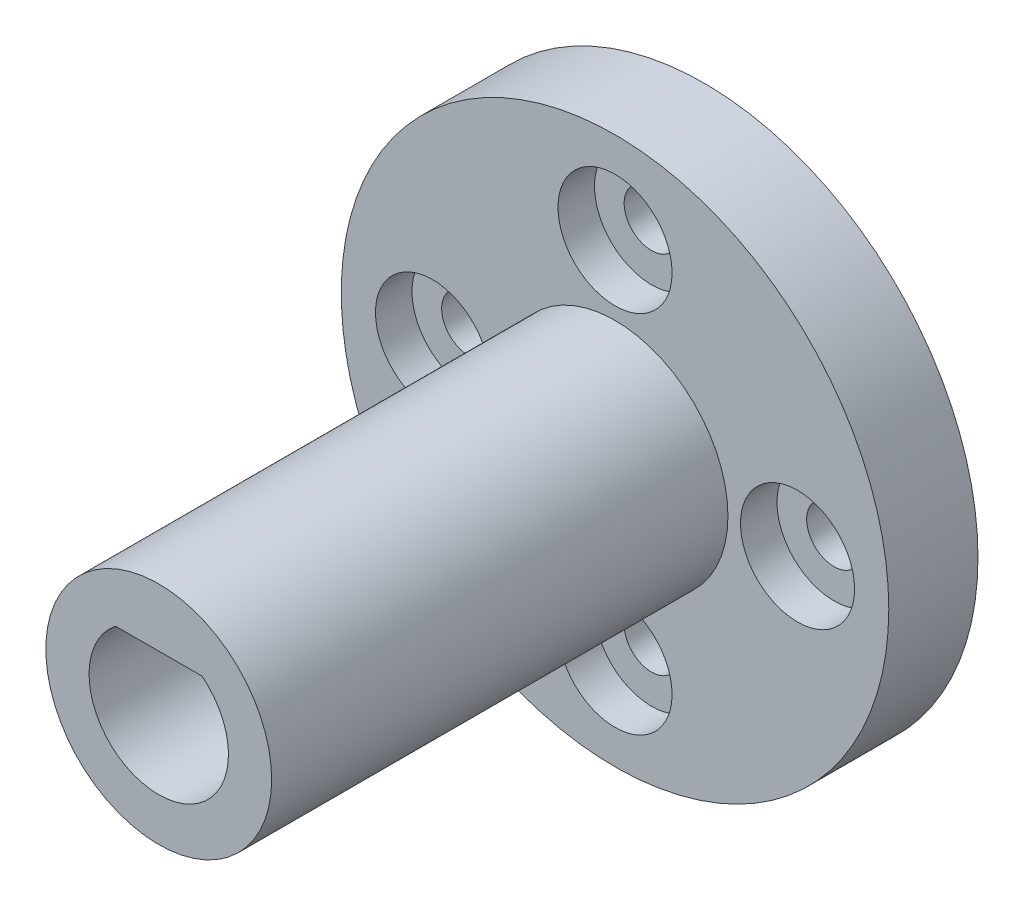
ISO-10303-21;
HEADER;
FILE_DESCRIPTION(('STEP AP214'),'2;1');
FILE_NAME('part.step','',(''),(''),'','','');
FILE_SCHEMA(('AUTOMOTIVE_DESIGN { 1 0 10303 214 1 1 1 1 }'));
ENDSEC;
DATA;
#1=APPLICATION_CONTEXT('core data for automotive mechanical design processes');
#2=APPLICATION_PROTOCOL_DEFINITION('international standard','automotive_design',2000,#1);
#3=PRODUCT_CONTEXT('',#1,'mechanical');
#4=PRODUCT('Part','Part','',(#3));
#5=PRODUCT_RELATED_PRODUCT_CATEGORY('part','',(#4));
#6=PRODUCT_DEFINITION_FORMATION('','',#4);
#7=PRODUCT_DEFINITION_CONTEXT('part definition',#1,'design');
#8=PRODUCT_DEFINITION('design','',#6,#7);
#9=PRODUCT_DEFINITION_SHAPE('','',#8);
#10=(LENGTH_UNIT() NAMED_UNIT(*) SI_UNIT(.MILLI.,.METRE.));
#11=(NAMED_UNIT(*) PLANE_ANGLE_UNIT() SI_UNIT($,.RADIAN.));
#12=(NAMED_UNIT(*) SI_UNIT($,.STERADIAN.) SOLID_ANGLE_UNIT());
#13=UNCERTAINTY_MEASURE_WITH_UNIT(LENGTH_MEASURE(1.E-05),#10,'distance_accuracy_value','');
#14=(GEOMETRIC_REPRESENTATION_CONTEXT(3) GLOBAL_UNCERTAINTY_ASSIGNED_CONTEXT((#13)) GLOBAL_UNIT_ASSIGNED_CONTEXT((#10,
#11,#12)) REPRESENTATION_CONTEXT('',''));
#15=CARTESIAN_POINT('',(0.,0.,0.));
#16=DIRECTION('',(0.,0.,1.));
#17=DIRECTION('',(1.,0.,0.));
#18=AXIS2_PLACEMENT_3D('',#15,#16,#17);
#19=CARTESIAN_POINT('',(0.,0.,3.91));
#20=DIRECTION('',(0.,0.,-1.));
#21=DIRECTION('',(-1.,0.,0.));
#22=AXIS2_PLACEMENT_3D('',#19,#20,#21);
#23=CYLINDRICAL_SURFACE('',#22,12.);
#24=CARTESIAN_POINT('',(0.,0.,3.91));
#25=DIRECTION('',(0.,0.,1.));
#26=DIRECTION('',(1.,0.,0.));
#27=AXIS2_PLACEMENT_3D('',#24,#25,#26);
#28=CIRCLE('',#27,12.);
#29=CARTESIAN_POINT('',(12.,0.,3.91));
#30=VERTEX_POINT('',#29);
#31=EDGE_CURVE('E11',#30,#30,#28,.T.);
#32=ORIENTED_EDGE('',*,*,#31,.F.);
#33=EDGE_LOOP('',(#32));
#34=FACE_BOUND('',#33,.T.);
#35=CARTESIAN_POINT('',(0.,0.,0.));
#36=DIRECTION('',(0.,0.,1.));
#37=DIRECTION('',(1.,0.,0.));
#38=AXIS2_PLACEMENT_3D('',#35,#36,#37);
#39=CIRCLE('',#38,12.);
#40=CARTESIAN_POINT('',(12.,0.,0.));
#41=VERTEX_POINT('',#40);
#42=EDGE_CURVE('E40',#41,#41,#39,.T.);
#43=ORIENTED_EDGE('',*,*,#42,.T.);
#44=EDGE_LOOP('',(#43));
#45=FACE_BOUND('',#44,.T.);
#46=ADVANCED_FACE('F37',(#34,#45),#23,.T.);
#47=CARTESIAN_POINT('',(0.,0.,3.91));
#48=DIRECTION('',(0.,0.,1.));
#49=DIRECTION('',(1.,0.,0.));
#50=AXIS2_PLACEMENT_3D('',#47,#48,#49);
#51=PLANE('',#50);
#52=CARTESIAN_POINT('',(8.,0.,3.91));
#53=DIRECTION('',(0.,0.,1.));
#54=DIRECTION('',(1.,0.,0.));
#55=AXIS2_PLACEMENT_3D('',#52,#53,#54);
#56=CIRCLE('',#55,2.5);
#57=CARTESIAN_POINT('',(10.5,0.,3.91));
#58=VERTEX_POINT('',#57);
#59=EDGE_CURVE('E307',#58,#58,#56,.T.);
#60=ORIENTED_EDGE('',*,*,#59,.F.);
#61=EDGE_LOOP('',(#60));
#62=FACE_BOUND('',#61,.T.);
#63=CARTESIAN_POINT('',(0.,-8.,3.91));
#64=DIRECTION('',(0.,0.,1.));
#65=DIRECTION('',(1.,0.,0.));
#66=AXIS2_PLACEMENT_3D('',#63,#64,#65);
#67=CIRCLE('',#66,2.5);
#68=CARTESIAN_POINT('',(2.5,-8.,3.91));
#69=VERTEX_POINT('',#68);
#70=EDGE_CURVE('E317',#69,#69,#67,.T.);
#71=ORIENTED_EDGE('',*,*,#70,.F.);
#72=EDGE_LOOP('',(#71));
#73=FACE_BOUND('',#72,.T.);
#74=CARTESIAN_POINT('',(-8.,0.,3.91));
#75=DIRECTION('',(0.,0.,1.));
#76=DIRECTION('',(1.,0.,0.));
#77=AXIS2_PLACEMENT_3D('',#74,#75,#76);
#78=CIRCLE('',#77,2.5);
#79=CARTESIAN_POINT('',(-5.50000000000001,0.,3.91));
#80=VERTEX_POINT('',#79);
#81=EDGE_CURVE('E329',#80,#80,#78,.T.);
#82=ORIENTED_EDGE('',*,*,#81,.F.);
#83=EDGE_LOOP('',(#82));
#84=FACE_BOUND('',#83,.T.);
#85=CARTESIAN_POINT('',(0.,8.,3.91));
#86=DIRECTION('',(0.,0.,1.));
#87=DIRECTION('',(1.,0.,0.));
#88=AXIS2_PLACEMENT_3D('',#85,#86,#87);
#89=CIRCLE('',#88,2.5);
#90=CARTESIAN_POINT('',(2.5,8.,3.91));
#91=VERTEX_POINT('',#90);
#92=EDGE_CURVE('E341',#91,#91,#89,.T.);
#93=ORIENTED_EDGE('',*,*,#92,.F.);
#94=EDGE_LOOP('',(#93));
#95=FACE_BOUND('',#94,.T.);
#96=CARTESIAN_POINT('',(0.,0.,3.91));
#97=DIRECTION('',(0.,0.,1.));
#98=DIRECTION('',(1.,0.,0.));
#99=AXIS2_PLACEMENT_3D('',#96,#97,#98);
#100=CIRCLE('',#99,4.95);
#101=CARTESIAN_POINT('',(4.95,0.,3.91));
#102=VERTEX_POINT('',#101);
#103=EDGE_CURVE('E77',#102,#102,#100,.T.);
#104=ORIENTED_EDGE('',*,*,#103,.F.);
#105=EDGE_LOOP('',(#104));
#106=FACE_BOUND('',#105,.T.);
#107=ORIENTED_EDGE('',*,*,#31,.T.);
#108=EDGE_LOOP('',(#107));
#109=FACE_BOUND('',#108,.T.);
#110=ADVANCED_FACE('F96',(#62,#73,#84,#95,#106,#109),#51,.T.);
#111=CARTESIAN_POINT('',(0.,0.,0.));
#112=DIRECTION('',(0.,0.,1.));
#113=DIRECTION('',(1.,0.,0.));
#114=AXIS2_PLACEMENT_3D('',#111,#112,#113);
#115=PLANE('',#114);
#116=CARTESIAN_POINT('',(8.,0.,0.));
#117=DIRECTION('',(0.,0.,1.));
#118=DIRECTION('',(1.,0.,0.));
#119=AXIS2_PLACEMENT_3D('',#116,#117,#118);
#120=CIRCLE('',#119,1.2);
#121=CARTESIAN_POINT('',(9.2,0.,0.));
#122=VERTEX_POINT('',#121);
#123=EDGE_CURVE('E314',#122,#122,#120,.T.);
#124=ORIENTED_EDGE('',*,*,#123,.T.);
#125=EDGE_LOOP('',(#124));
#126=FACE_BOUND('',#125,.T.);
#127=CARTESIAN_POINT('',(0.,-8.,0.));
#128=DIRECTION('',(0.,0.,1.));
#129=DIRECTION('',(1.,0.,0.));
#130=AXIS2_PLACEMENT_3D('',#127,#128,#129);
#131=CIRCLE('',#130,1.2);
#132=CARTESIAN_POINT('',(1.2,-8.,0.));
#133=VERTEX_POINT('',#132);
#134=EDGE_CURVE('E326',#133,#133,#131,.T.);
#135=ORIENTED_EDGE('',*,*,#134,.T.);
#136=EDGE_LOOP('',(#135));
#137=FACE_BOUND('',#136,.T.);
#138=CARTESIAN_POINT('',(-8.,0.,0.));
#139=DIRECTION('',(0.,0.,1.));
#140=DIRECTION('',(1.,0.,0.));
#141=AXIS2_PLACEMENT_3D('',#138,#139,#140);
#142=CIRCLE('',#141,1.2);
#143=CARTESIAN_POINT('',(-6.8,0.,0.));
#144=VERTEX_POINT('',#143);
#145=EDGE_CURVE('E338',#144,#144,#142,.T.);
#146=ORIENTED_EDGE('',*,*,#145,.T.);
#147=EDGE_LOOP('',(#146));
#148=FACE_BOUND('',#147,.T.);
#149=CARTESIAN_POINT('',(0.,8.,0.));
#150=DIRECTION('',(0.,0.,1.));
#151=DIRECTION('',(1.,0.,0.));
#152=AXIS2_PLACEMENT_3D('',#149,#150,#151);
#153=CIRCLE('',#152,1.2);
#154=CARTESIAN_POINT('',(1.2,8.,0.));
#155=VERTEX_POINT('',#154);
#156=EDGE_CURVE('E67',#155,#155,#153,.T.);
#157=ORIENTED_EDGE('',*,*,#156,.T.);
#158=EDGE_LOOP('',(#157));
#159=FACE_BOUND('',#158,.T.);
#160=CARTESIAN_POINT('',(0.,0.,0.));
#161=DIRECTION('',(0.,0.,-1.));
#162=DIRECTION('',(-1.,0.,0.));
#163=AXIS2_PLACEMENT_3D('',#160,#161,#162);
#164=CIRCLE('',#163,4.);
#165=CARTESIAN_POINT('',(-4.,0.,0.));
#166=VERTEX_POINT('',#165);
#167=EDGE_CURVE('E84',#166,#166,#164,.T.);
#168=ORIENTED_EDGE('',*,*,#167,.F.);
#169=EDGE_LOOP('',(#168));
#170=FACE_BOUND('',#169,.T.);
#171=ORIENTED_EDGE('',*,*,#42,.F.);
#172=EDGE_LOOP('',(#171));
#173=FACE_BOUND('',#172,.T.);
#174=ADVANCED_FACE('F93',(#126,#137,#148,#159,#170,#173),#115,.F.);
#175=CARTESIAN_POINT('',(0.,0.,1.91));
#176=DIRECTION('',(0.,0.,-1.));
#177=DIRECTION('',(-1.,0.,0.));
#178=AXIS2_PLACEMENT_3D('',#175,#176,#177);
#179=CYLINDRICAL_SURFACE('',#178,4.);
#180=CARTESIAN_POINT('',(0.,0.,1.91));
#181=DIRECTION('',(0.,0.,-1.));
#182=DIRECTION('',(-1.,0.,0.));
#183=AXIS2_PLACEMENT_3D('',#180,#181,#182);
#184=CIRCLE('',#183,4.);
#185=CARTESIAN_POINT('',(-4.,0.,1.91));
#186=VERTEX_POINT('',#185);
#187=EDGE_CURVE('E85',#186,#186,#184,.T.);
#188=CARTESIAN_POINT('',(-4.,0.,1.91));
#189=CARTESIAN_POINT('',(-4.,0.,1.89010416666667));
#190=CARTESIAN_POINT('',(-4.,0.,1.87020833333333));
#191=CARTESIAN_POINT('',(-4.,0.,1.83041666666667));
#192=CARTESIAN_POINT('',(-4.,0.,1.81052083333333));
#193=CARTESIAN_POINT('',(-4.,0.,1.77072916666667));
#194=CARTESIAN_POINT('',(-4.,0.,1.75083333333333));
#195=CARTESIAN_POINT('',(-4.,0.,1.71104166666667));
#196=CARTESIAN_POINT('',(-4.,0.,1.69114583333333));
#197=CARTESIAN_POINT('',(-4.,0.,1.65135416666667));
#198=CARTESIAN_POINT('',(-4.,0.,1.63145833333333));
#199=CARTESIAN_POINT('',(-4.,0.,1.59166666666667));
#200=CARTESIAN_POINT('',(-4.,0.,1.57177083333333));
#201=CARTESIAN_POINT('',(-4.,0.,1.53197916666667));
#202=CARTESIAN_POINT('',(-4.,0.,1.51208333333333));
#203=CARTESIAN_POINT('',(-4.,0.,1.47229166666667));
#204=CARTESIAN_POINT('',(-4.,0.,1.45239583333333));
#205=CARTESIAN_POINT('',(-4.,0.,1.41260416666667));
#206=CARTESIAN_POINT('',(-4.,0.,1.39270833333333));
#207=CARTESIAN_POINT('',(-4.,0.,1.35291666666667));
#208=CARTESIAN_POINT('',(-4.,0.,1.33302083333333));
#209=CARTESIAN_POINT('',(-4.,0.,1.29322916666667));
#210=CARTESIAN_POINT('',(-4.,0.,1.27333333333333));
#211=CARTESIAN_POINT('',(-4.,0.,1.23354166666667));
#212=CARTESIAN_POINT('',(-4.,0.,1.21364583333333));
#213=CARTESIAN_POINT('',(-4.,0.,1.17385416666667));
#214=CARTESIAN_POINT('',(-4.,0.,1.15395833333333));
#215=CARTESIAN_POINT('',(-4.,0.,1.11416666666667));
#216=CARTESIAN_POINT('',(-4.,0.,1.09427083333333));
#217=CARTESIAN_POINT('',(-4.,0.,1.05447916666667));
#218=CARTESIAN_POINT('',(-4.,0.,1.03458333333333));
#219=CARTESIAN_POINT('',(-4.,0.,0.994791666666667));
#220=CARTESIAN_POINT('',(-4.,0.,0.974895833333334));
#221=CARTESIAN_POINT('',(-4.,0.,0.935104166666667));
#222=CARTESIAN_POINT('',(-4.,0.,0.915208333333333));
#223=CARTESIAN_POINT('',(-4.,0.,0.875416666666667));
#224=CARTESIAN_POINT('',(-4.,0.,0.855520833333333));
#225=CARTESIAN_POINT('',(-4.,0.,0.815729166666667));
#226=CARTESIAN_POINT('',(-4.,0.,0.795833333333333));
#227=CARTESIAN_POINT('',(-4.,0.,0.756041666666667));
#228=CARTESIAN_POINT('',(-4.,0.,0.736145833333333));
#229=CARTESIAN_POINT('',(-4.,0.,0.696354166666667));
#230=CARTESIAN_POINT('',(-4.,0.,0.676458333333333));
#231=CARTESIAN_POINT('',(-4.,0.,0.636666666666667));
#232=CARTESIAN_POINT('',(-4.,0.,0.616770833333333));
#233=CARTESIAN_POINT('',(-4.,0.,0.576979166666667));
#234=CARTESIAN_POINT('',(-4.,0.,0.557083333333333));
#235=CARTESIAN_POINT('',(-4.,0.,0.517291666666667));
#236=CARTESIAN_POINT('',(-4.,0.,0.497395833333333));
#237=CARTESIAN_POINT('',(-4.,0.,0.457604166666667));
#238=CARTESIAN_POINT('',(-4.,0.,0.437708333333333));
#239=CARTESIAN_POINT('',(-4.,0.,0.397916666666667));
#240=CARTESIAN_POINT('',(-4.,0.,0.378020833333333));
#241=CARTESIAN_POINT('',(-4.,0.,0.338229166666667));
#242=CARTESIAN_POINT('',(-4.,0.,0.318333333333333));
#243=CARTESIAN_POINT('',(-4.,0.,0.278541666666667));
#244=CARTESIAN_POINT('',(-4.,0.,0.258645833333333));
#245=CARTESIAN_POINT('',(-4.,0.,0.218854166666667));
#246=CARTESIAN_POINT('',(-4.,0.,0.198958333333333));
#247=CARTESIAN_POINT('',(-4.,0.,0.159166666666667));
#248=CARTESIAN_POINT('',(-4.,0.,0.139270833333333));
#249=CARTESIAN_POINT('',(-4.,0.,0.0994791666666668));
#250=CARTESIAN_POINT('',(-4.,0.,0.0795833333333334));
#251=CARTESIAN_POINT('',(-4.,0.,0.0397916666666667));
#252=CARTESIAN_POINT('',(-4.,0.,0.0198958333333334));
#253=CARTESIAN_POINT('',(-4.,0.,0.));
#254=B_SPLINE_CURVE_WITH_KNOTS('',3,(#188,#189,#190,#191,#192,#193,#194,#195,#196,#197,#198,
#199,#200,#201,#202,#203,#204,#205,#206,#207,#208,#209,#210,#211,#212,#213,#214,#215,#216,#217,
#218,#219,#220,#221,#222,#223,#224,#225,#226,#227,#228,#229,#230,#231,#232,#233,#234,#235,#236,
#237,#238,#239,#240,#241,#242,#243,#244,#245,#246,#247,#248,#249,#250,#251,#252,#253),
.UNSPECIFIED.,.F.,.F.,(4,2,2,2,2,2,2,2,2,2,2,2,2,2,2,2,2,2,2,2,2,2,2,2,2,2,2,2,2,2,2,2,4),(0.,
0.0596874999999998,0.119375,0.1790625,0.23875,0.2984375,0.358125,0.4178125,0.4775,0.5371875,
0.596875,0.6565625,0.71625,0.7759375,0.835625,0.8953125,0.955,1.0146875,1.074375,1.1340625,
1.19375,1.2534375,1.313125,1.3728125,1.4325,1.4921875,1.551875,1.6115625,1.67125,1.7309375,
1.790625,1.8503125,1.91),.UNSPECIFIED.);
#255=EDGE_CURVE('BSEAM91',#186,#166,#254,.T.);
#256=ORIENTED_EDGE('',*,*,#187,.F.);
#257=ORIENTED_EDGE('',*,*,#167,.T.);
#258=ORIENTED_EDGE('',*,*,#255,.T.);
#259=ORIENTED_EDGE('',*,*,#255,.F.);
#260=EDGE_LOOP('',(#256,#258,#257,#259));
#261=FACE_BOUND('',#260,.T.);
#262=ADVANCED_FACE('F91',(#261),#179,.F.);
#263=CARTESIAN_POINT('',(0.,0.,1.91));
#264=DIRECTION('',(0.,0.,-1.));
#265=DIRECTION('',(-1.,0.,0.));
#266=AXIS2_PLACEMENT_3D('',#263,#264,#265);
#267=PLANE('',#266);
#268=ORIENTED_EDGE('',*,*,#187,.T.);
#269=EDGE_LOOP('',(#268));
#270=FACE_BOUND('',#269,.T.);
#271=ADVANCED_FACE('F140',(#270),#267,.T.);
#272=CARTESIAN_POINT('',(0.,2.395,23.91));
#273=DIRECTION('',(0.,-1.,0.));
#274=DIRECTION('',(0.,0.,-1.));
#275=AXIS2_PLACEMENT_3D('',#272,#273,#274);
#276=PLANE('',#275);
#277=DIRECTION('',(-1.,0.,0.));
#278=VECTOR('',#277,1.);
#279=CARTESIAN_POINT('',(0.,2.395,3.91));
#280=LINE('',#279,#278);
#281=CARTESIAN_POINT('',(1.89657586191536,2.395,3.91));
#282=VERTEX_POINT('',#281);
#283=CARTESIAN_POINT('',(-1.89657586191536,2.395,3.91));
#284=VERTEX_POINT('',#283);
#285=EDGE_CURVE('E64',#282,#284,#280,.T.);
#286=ORIENTED_EDGE('',*,*,#285,.F.);
#287=DIRECTION('',(0.,0.,-1.));
#288=VECTOR('',#287,1.);
#289=CARTESIAN_POINT('',(1.89657586191536,2.395,23.91));
#290=LINE('',#289,#288);
#291=CARTESIAN_POINT('',(1.89657586191536,2.395,23.91));
#292=VERTEX_POINT('',#291);
#293=EDGE_CURVE('E73',#292,#282,#290,.T.);
#294=ORIENTED_EDGE('',*,*,#293,.F.);
#295=DIRECTION('',(-1.,0.,0.));
#296=VECTOR('',#295,1.);
#297=CARTESIAN_POINT('',(0.,2.395,23.91));
#298=LINE('',#297,#296);
#299=CARTESIAN_POINT('',(-1.89657586191536,2.395,23.91));
#300=VERTEX_POINT('',#299);
#301=EDGE_CURVE('E71',#292,#300,#298,.T.);
#302=ORIENTED_EDGE('',*,*,#301,.T.);
#303=DIRECTION('',(0.,0.,-1.));
#304=VECTOR('',#303,1.);
#305=CARTESIAN_POINT('',(-1.89657586191536,2.395,23.91));
#306=LINE('',#305,#304);
#307=EDGE_CURVE('E58',#300,#284,#306,.T.);
#308=ORIENTED_EDGE('',*,*,#307,.T.);
#309=EDGE_LOOP('',(#286,#294,#302,#308));
#310=FACE_BOUND('',#309,.T.);
#311=ADVANCED_FACE('F69',(#310),#276,.T.);
#312=CARTESIAN_POINT('',(0.,0.,23.91));
#313=DIRECTION('',(0.,0.,-1.));
#314=DIRECTION('',(-1.,0.,0.));
#315=AXIS2_PLACEMENT_3D('',#312,#313,#314);
#316=CYLINDRICAL_SURFACE('',#315,3.055);
#317=CARTESIAN_POINT('',(0.,0.,3.91));
#318=DIRECTION('',(0.,0.,1.));
#319=DIRECTION('',(1.,0.,0.));
#320=AXIS2_PLACEMENT_3D('',#317,#318,#319);
#321=CIRCLE('',#320,3.055);
#322=EDGE_CURVE('E50',#284,#282,#321,.T.);
#323=ORIENTED_EDGE('',*,*,#322,.F.);
#324=ORIENTED_EDGE('',*,*,#307,.F.);
#325=CARTESIAN_POINT('',(0.,0.,23.91));
#326=DIRECTION('',(0.,0.,1.));
#327=DIRECTION('',(1.,0.,0.));
#328=AXIS2_PLACEMENT_3D('',#325,#326,#327);
#329=CIRCLE('',#328,3.055);
#330=EDGE_CURVE('E353',#300,#292,#329,.T.);
#331=ORIENTED_EDGE('',*,*,#330,.T.);
#332=ORIENTED_EDGE('',*,*,#293,.T.);
#333=EDGE_LOOP('',(#323,#324,#331,#332));
#334=FACE_BOUND('',#333,.T.);
#335=ADVANCED_FACE('F76',(#334),#316,.F.);
#336=CARTESIAN_POINT('',(0.,0.,23.91));
#337=DIRECTION('',(0.,0.,-1.));
#338=DIRECTION('',(-1.,0.,0.));
#339=AXIS2_PLACEMENT_3D('',#336,#337,#338);
#340=CYLINDRICAL_SURFACE('',#339,4.95);
#341=CARTESIAN_POINT('',(0.,0.,23.91));
#342=DIRECTION('',(0.,0.,1.));
#343=DIRECTION('',(1.,0.,0.));
#344=AXIS2_PLACEMENT_3D('',#341,#342,#343);
#345=CIRCLE('',#344,4.95);
#346=CARTESIAN_POINT('',(4.95,0.,23.91));
#347=VERTEX_POINT('',#346);
#348=EDGE_CURVE('E74',#347,#347,#345,.T.);
#349=ORIENTED_EDGE('',*,*,#348,.F.);
#350=EDGE_LOOP('',(#349));
#351=FACE_BOUND('',#350,.T.);
#352=ORIENTED_EDGE('',*,*,#103,.T.);
#353=EDGE_LOOP('',(#352));
#354=FACE_BOUND('',#353,.T.);
#355=ADVANCED_FACE('F125',(#351,#354),#340,.T.);
#356=CARTESIAN_POINT('',(0.,0.,23.91));
#357=DIRECTION('',(0.,0.,1.));
#358=DIRECTION('',(1.,0.,0.));
#359=AXIS2_PLACEMENT_3D('',#356,#357,#358);
#360=PLANE('',#359);
#361=ORIENTED_EDGE('',*,*,#301,.F.);
#362=ORIENTED_EDGE('',*,*,#330,.F.);
#363=EDGE_LOOP('',(#361,#362));
#364=FACE_BOUND('',#363,.T.);
#365=ORIENTED_EDGE('',*,*,#348,.T.);
#366=EDGE_LOOP('',(#365));
#367=FACE_BOUND('',#366,.T.);
#368=ADVANCED_FACE('F117',(#364,#367),#360,.T.);
#369=ORIENTED_EDGE('',*,*,#285,.T.);
#370=ORIENTED_EDGE('',*,*,#322,.T.);
#371=EDGE_LOOP('',(#369,#370));
#372=FACE_BOUND('',#371,.T.);
#373=ADVANCED_FACE('F65',(#372),#51,.T.);
#374=CARTESIAN_POINT('',(0.,8.,3.91));
#375=DIRECTION('',(0.,0.,1.));
#376=DIRECTION('',(1.,0.,0.));
#377=AXIS2_PLACEMENT_3D('',#374,#375,#376);
#378=CYLINDRICAL_SURFACE('',#377,1.2);
#379=ORIENTED_EDGE('',*,*,#156,.F.);
#380=EDGE_LOOP('',(#379));
#381=FACE_BOUND('',#380,.T.);
#382=CARTESIAN_POINT('',(0.,8.,2.31));
#383=DIRECTION('',(0.,0.,1.));
#384=DIRECTION('',(1.,0.,0.));
#385=AXIS2_PLACEMENT_3D('',#382,#383,#384);
#386=CIRCLE('',#385,1.2);
#387=CARTESIAN_POINT('',(1.2,8.,2.31));
#388=VERTEX_POINT('',#387);
#389=EDGE_CURVE('E347',#388,#388,#386,.T.);
#390=ORIENTED_EDGE('',*,*,#389,.T.);
#391=EDGE_LOOP('',(#390));
#392=FACE_BOUND('',#391,.T.);
#393=ADVANCED_FACE('F116',(#381,#392),#378,.F.);
#394=CARTESIAN_POINT('',(1.2,8.,2.31));
#395=DIRECTION('',(0.,0.,-1.));
#396=DIRECTION('',(-1.,0.,0.));
#397=AXIS2_PLACEMENT_3D('',#394,#395,#396);
#398=PLANE('',#397);
#399=ORIENTED_EDGE('',*,*,#389,.F.);
#400=EDGE_LOOP('',(#399));
#401=FACE_BOUND('',#400,.T.);
#402=CARTESIAN_POINT('',(0.,8.,2.31));
#403=DIRECTION('',(0.,0.,1.));
#404=DIRECTION('',(1.,0.,0.));
#405=AXIS2_PLACEMENT_3D('',#402,#403,#404);
#406=CIRCLE('',#405,2.5);
#407=CARTESIAN_POINT('',(2.5,8.,2.31));
#408=VERTEX_POINT('',#407);
#409=EDGE_CURVE('E344',#408,#408,#406,.T.);
#410=ORIENTED_EDGE('',*,*,#409,.T.);
#411=EDGE_LOOP('',(#410));
#412=FACE_BOUND('',#411,.T.);
#413=ADVANCED_FACE('F122',(#401,#412),#398,.F.);
#414=CARTESIAN_POINT('',(0.,8.,3.91));
#415=DIRECTION('',(0.,0.,1.));
#416=DIRECTION('',(1.,0.,0.));
#417=AXIS2_PLACEMENT_3D('',#414,#415,#416);
#418=CYLINDRICAL_SURFACE('',#417,2.5);
#419=ORIENTED_EDGE('',*,*,#409,.F.);
#420=EDGE_LOOP('',(#419));
#421=FACE_BOUND('',#420,.T.);
#422=ORIENTED_EDGE('',*,*,#92,.T.);
#423=EDGE_LOOP('',(#422));
#424=FACE_BOUND('',#423,.T.);
#425=ADVANCED_FACE('F190',(#421,#424),#418,.F.);
#426=CARTESIAN_POINT('',(-8.,0.,3.91));
#427=DIRECTION('',(0.,0.,1.));
#428=DIRECTION('',(1.,0.,0.));
#429=AXIS2_PLACEMENT_3D('',#426,#427,#428);
#430=CYLINDRICAL_SURFACE('',#429,1.2);
#431=ORIENTED_EDGE('',*,*,#145,.F.);
#432=EDGE_LOOP('',(#431));
#433=FACE_BOUND('',#432,.T.);
#434=CARTESIAN_POINT('',(-8.,0.,2.31));
#435=DIRECTION('',(0.,0.,1.));
#436=DIRECTION('',(1.,0.,0.));
#437=AXIS2_PLACEMENT_3D('',#434,#435,#436);
#438=CIRCLE('',#437,1.2);
#439=CARTESIAN_POINT('',(-6.8,0.,2.31));
#440=VERTEX_POINT('',#439);
#441=EDGE_CURVE('E335',#440,#440,#438,.T.);
#442=ORIENTED_EDGE('',*,*,#441,.T.);
#443=EDGE_LOOP('',(#442));
#444=FACE_BOUND('',#443,.T.);
#445=ADVANCED_FACE('F198',(#433,#444),#430,.F.);
#446=CARTESIAN_POINT('',(-6.8,0.,2.31));
#447=DIRECTION('',(0.,0.,-1.));
#448=DIRECTION('',(-1.,0.,0.));
#449=AXIS2_PLACEMENT_3D('',#446,#447,#448);
#450=PLANE('',#449);
#451=ORIENTED_EDGE('',*,*,#441,.F.);
#452=EDGE_LOOP('',(#451));
#453=FACE_BOUND('',#452,.T.);
#454=CARTESIAN_POINT('',(-8.,0.,2.31));
#455=DIRECTION('',(0.,0.,1.));
#456=DIRECTION('',(1.,0.,0.));
#457=AXIS2_PLACEMENT_3D('',#454,#455,#456);
#458=CIRCLE('',#457,2.5);
#459=CARTESIAN_POINT('',(-5.5,0.,2.31));
#460=VERTEX_POINT('',#459);
#461=EDGE_CURVE('E332',#460,#460,#458,.T.);
#462=ORIENTED_EDGE('',*,*,#461,.T.);
#463=EDGE_LOOP('',(#462));
#464=FACE_BOUND('',#463,.T.);
#465=ADVANCED_FACE('F218',(#453,#464),#450,.F.);
#466=CARTESIAN_POINT('',(-8.,0.,3.91));
#467=DIRECTION('',(0.,0.,1.));
#468=DIRECTION('',(1.,0.,0.));
#469=AXIS2_PLACEMENT_3D('',#466,#467,#468);
#470=CYLINDRICAL_SURFACE('',#469,2.5);
#471=ORIENTED_EDGE('',*,*,#461,.F.);
#472=EDGE_LOOP('',(#471));
#473=FACE_BOUND('',#472,.T.);
#474=ORIENTED_EDGE('',*,*,#81,.T.);
#475=EDGE_LOOP('',(#474));
#476=FACE_BOUND('',#475,.T.);
#477=ADVANCED_FACE('F228',(#473,#476),#470,.F.);
#478=CARTESIAN_POINT('',(0.,-8.,3.91));
#479=DIRECTION('',(0.,0.,1.));
#480=DIRECTION('',(1.,0.,0.));
#481=AXIS2_PLACEMENT_3D('',#478,#479,#480);
#482=CYLINDRICAL_SURFACE('',#481,1.2);
#483=ORIENTED_EDGE('',*,*,#134,.F.);
#484=EDGE_LOOP('',(#483));
#485=FACE_BOUND('',#484,.T.);
#486=CARTESIAN_POINT('',(0.,-8.,2.31));
#487=DIRECTION('',(0.,0.,1.));
#488=DIRECTION('',(1.,0.,0.));
#489=AXIS2_PLACEMENT_3D('',#486,#487,#488);
#490=CIRCLE('',#489,1.2);
#491=CARTESIAN_POINT('',(1.2,-8.,2.31));
#492=VERTEX_POINT('',#491);
#493=EDGE_CURVE('E323',#492,#492,#490,.T.);
#494=ORIENTED_EDGE('',*,*,#493,.T.);
#495=EDGE_LOOP('',(#494));
#496=FACE_BOUND('',#495,.T.);
#497=ADVANCED_FACE('F238',(#485,#496),#482,.F.);
#498=CARTESIAN_POINT('',(1.2,-8.,2.31));
#499=DIRECTION('',(0.,0.,-1.));
#500=DIRECTION('',(-1.,0.,0.));
#501=AXIS2_PLACEMENT_3D('',#498,#499,#500);
#502=PLANE('',#501);
#503=ORIENTED_EDGE('',*,*,#493,.F.);
#504=EDGE_LOOP('',(#503));
#505=FACE_BOUND('',#504,.T.);
#506=CARTESIAN_POINT('',(0.,-8.,2.31));
#507=DIRECTION('',(0.,0.,1.));
#508=DIRECTION('',(1.,0.,0.));
#509=AXIS2_PLACEMENT_3D('',#506,#507,#508);
#510=CIRCLE('',#509,2.5);
#511=CARTESIAN_POINT('',(2.5,-8.,2.31));
#512=VERTEX_POINT('',#511);
#513=EDGE_CURVE('E320',#512,#512,#510,.T.);
#514=ORIENTED_EDGE('',*,*,#513,.T.);
#515=EDGE_LOOP('',(#514));
#516=FACE_BOUND('',#515,.T.);
#517=ADVANCED_FACE('F248',(#505,#516),#502,.F.);
#518=CARTESIAN_POINT('',(0.,-8.,3.91));
#519=DIRECTION('',(0.,0.,1.));
#520=DIRECTION('',(1.,0.,0.));
#521=AXIS2_PLACEMENT_3D('',#518,#519,#520);
#522=CYLINDRICAL_SURFACE('',#521,2.5);
#523=ORIENTED_EDGE('',*,*,#513,.F.);
#524=EDGE_LOOP('',(#523));
#525=FACE_BOUND('',#524,.T.);
#526=ORIENTED_EDGE('',*,*,#70,.T.);
#527=EDGE_LOOP('',(#526));
#528=FACE_BOUND('',#527,.T.);
#529=ADVANCED_FACE('F258',(#525,#528),#522,.F.);
#530=CARTESIAN_POINT('',(8.,0.,3.91));
#531=DIRECTION('',(0.,0.,1.));
#532=DIRECTION('',(1.,0.,0.));
#533=AXIS2_PLACEMENT_3D('',#530,#531,#532);
#534=CYLINDRICAL_SURFACE('',#533,1.2);
#535=ORIENTED_EDGE('',*,*,#123,.F.);
#536=EDGE_LOOP('',(#535));
#537=FACE_BOUND('',#536,.T.);
#538=CARTESIAN_POINT('',(8.,0.,2.31));
#539=DIRECTION('',(0.,0.,1.));
#540=DIRECTION('',(1.,0.,0.));
#541=AXIS2_PLACEMENT_3D('',#538,#539,#540);
#542=CIRCLE('',#541,1.2);
#543=CARTESIAN_POINT('',(9.2,0.,2.31));
#544=VERTEX_POINT('',#543);
#545=EDGE_CURVE('E309',#544,#544,#542,.T.);
#546=ORIENTED_EDGE('',*,*,#545,.T.);
#547=EDGE_LOOP('',(#546));
#548=FACE_BOUND('',#547,.T.);
#549=ADVANCED_FACE('F268',(#537,#548),#534,.F.);
#550=CARTESIAN_POINT('',(9.2,0.,2.31));
#551=DIRECTION('',(0.,0.,-1.));
#552=DIRECTION('',(-1.,0.,0.));
#553=AXIS2_PLACEMENT_3D('',#550,#551,#552);
#554=PLANE('',#553);
#555=ORIENTED_EDGE('',*,*,#545,.F.);
#556=EDGE_LOOP('',(#555));
#557=FACE_BOUND('',#556,.T.);
#558=CARTESIAN_POINT('',(8.,0.,2.31));
#559=DIRECTION('',(0.,0.,1.));
#560=DIRECTION('',(1.,0.,0.));
#561=AXIS2_PLACEMENT_3D('',#558,#559,#560);
#562=CIRCLE('',#561,2.5);
#563=CARTESIAN_POINT('',(10.5,0.,2.31));
#564=VERTEX_POINT('',#563);
#565=EDGE_CURVE('E305',#564,#564,#562,.T.);
#566=ORIENTED_EDGE('',*,*,#565,.T.);
#567=EDGE_LOOP('',(#566));
#568=FACE_BOUND('',#567,.T.);
#569=ADVANCED_FACE('F278',(#557,#568),#554,.F.);
#570=CARTESIAN_POINT('',(8.,0.,3.91));
#571=DIRECTION('',(0.,0.,1.));
#572=DIRECTION('',(1.,0.,0.));
#573=AXIS2_PLACEMENT_3D('',#570,#571,#572);
#574=CYLINDRICAL_SURFACE('',#573,2.5);
#575=ORIENTED_EDGE('',*,*,#565,.F.);
#576=EDGE_LOOP('',(#575));
#577=FACE_BOUND('',#576,.T.);
#578=ORIENTED_EDGE('',*,*,#59,.T.);
#579=EDGE_LOOP('',(#578));
#580=FACE_BOUND('',#579,.T.);
#581=ADVANCED_FACE('F288',(#577,#580),#574,.F.);
#582=CLOSED_SHELL('',(#46,#110,#174,#262,#271,#311,#335,#355,#368,#373,#393,#413,#425,#445,#465,
#477,#497,#517,#529,#549,#569,#581));
#583=MANIFOLD_SOLID_BREP('B2',#582);
#584=ADVANCED_BREP_SHAPE_REPRESENTATION('',(#18,#583),#14);
#585=SHAPE_DEFINITION_REPRESENTATION(#9,#584);
ENDSEC;
END-ISO-10303-21;
